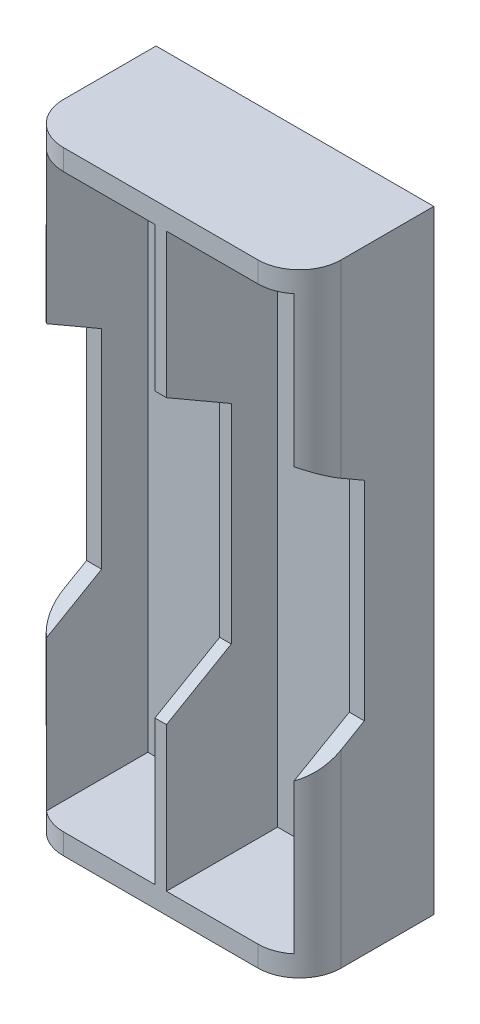
ISO-10303-21;
HEADER;
FILE_DESCRIPTION(('STEP AP214'),'2;1');
FILE_NAME('part.step','',(''),(''),'','','');
FILE_SCHEMA(('AUTOMOTIVE_DESIGN { 1 0 10303 214 1 1 1 1 }'));
ENDSEC;
DATA;
#1=APPLICATION_CONTEXT('core data for automotive mechanical design processes');
#2=APPLICATION_PROTOCOL_DEFINITION('international standard','automotive_design',2000,#1);
#3=PRODUCT_CONTEXT('',#1,'mechanical');
#4=PRODUCT('Part','Part','',(#3));
#5=PRODUCT_RELATED_PRODUCT_CATEGORY('part','',(#4));
#6=PRODUCT_DEFINITION_FORMATION('','',#4);
#7=PRODUCT_DEFINITION_CONTEXT('part definition',#1,'design');
#8=PRODUCT_DEFINITION('design','',#6,#7);
#9=PRODUCT_DEFINITION_SHAPE('','',#8);
#10=(LENGTH_UNIT() NAMED_UNIT(*) SI_UNIT(.MILLI.,.METRE.));
#11=(NAMED_UNIT(*) PLANE_ANGLE_UNIT() SI_UNIT($,.RADIAN.));
#12=(NAMED_UNIT(*) SI_UNIT($,.STERADIAN.) SOLID_ANGLE_UNIT());
#13=UNCERTAINTY_MEASURE_WITH_UNIT(LENGTH_MEASURE(1.E-05),#10,'distance_accuracy_value','');
#14=(GEOMETRIC_REPRESENTATION_CONTEXT(3) GLOBAL_UNCERTAINTY_ASSIGNED_CONTEXT((#13)) GLOBAL_UNIT_ASSIGNED_CONTEXT((#10,
#11,#12)) REPRESENTATION_CONTEXT('',''));
#15=CARTESIAN_POINT('',(0.,0.,0.));
#16=DIRECTION('',(0.,0.,1.));
#17=DIRECTION('',(1.,0.,0.));
#18=AXIS2_PLACEMENT_3D('',#15,#16,#17);
#19=CARTESIAN_POINT('',(8.4,52.3487910742456,8.));
#20=DIRECTION('',(0.,-1.,0.));
#21=DIRECTION('',(0.,0.,-1.));
#22=AXIS2_PLACEMENT_3D('',#19,#20,#21);
#23=CYLINDRICAL_SURFACE('',#22,3.6);
#24=CARTESIAN_POINT('',(8.4,-10.1547005383793,8.));
#25=DIRECTION('',(0.,-0.86602540378444,-0.499999999999998));
#26=DIRECTION('',(0.,-0.499999999999998,0.86602540378444));
#27=AXIS2_PLACEMENT_3D('',#24,#25,#26);
#28=ELLIPSE('',#27,4.1569219381653,3.6);
#29=CARTESIAN_POINT('',(10.7,-11.7536585324074,10.7694764848252));
#30=VERTEX_POINT('',#29);
#31=CARTESIAN_POINT('',(12.,-10.1547005383792,8.));
#32=VERTEX_POINT('',#31);
#33=EDGE_CURVE('E226',#30,#32,#28,.F.);
#34=ORIENTED_EDGE('',*,*,#33,.F.);
#35=DIRECTION('',(0.,-1.,0.));
#36=VECTOR('',#35,1.);
#37=CARTESIAN_POINT('',(10.7,52.3487910742456,10.7694764848252));
#38=LINE('',#37,#36);
#39=CARTESIAN_POINT('',(10.7,-24.7,10.7694764848252));
#40=VERTEX_POINT('',#39);
#41=EDGE_CURVE('E414',#40,#30,#38,.F.);
#42=ORIENTED_EDGE('',*,*,#41,.F.);
#43=CARTESIAN_POINT('',(8.4,-24.7,8.));
#44=DIRECTION('',(0.,-1.,0.));
#45=DIRECTION('',(0.,0.,-1.));
#46=AXIS2_PLACEMENT_3D('',#43,#44,#45);
#47=CIRCLE('',#46,3.6);
#48=CARTESIAN_POINT('',(8.4,-24.7,11.6));
#49=VERTEX_POINT('',#48);
#50=EDGE_CURVE('E355',#49,#40,#47,.F.);
#51=ORIENTED_EDGE('',*,*,#50,.F.);
#52=DIRECTION('',(0.,-1.,0.));
#53=VECTOR('',#52,1.);
#54=CARTESIAN_POINT('',(8.4,52.3487910742456,11.6));
#55=LINE('',#54,#53);
#56=CARTESIAN_POINT('',(8.4,-26.5,11.6));
#57=VERTEX_POINT('',#56);
#58=EDGE_CURVE('E375',#49,#57,#55,.T.);
#59=ORIENTED_EDGE('',*,*,#58,.T.);
#60=CARTESIAN_POINT('',(8.4,-26.5,8.));
#61=DIRECTION('',(0.,-1.,0.));
#62=DIRECTION('',(0.,0.,-1.));
#63=AXIS2_PLACEMENT_3D('',#60,#61,#62);
#64=CIRCLE('',#63,3.6);
#65=CARTESIAN_POINT('',(12.,-26.5,8.));
#66=VERTEX_POINT('',#65);
#67=EDGE_CURVE('E359',#66,#57,#64,.T.);
#68=ORIENTED_EDGE('',*,*,#67,.F.);
#69=DIRECTION('',(0.,-1.,0.));
#70=VECTOR('',#69,1.);
#71=CARTESIAN_POINT('',(12.,52.3487910742456,8.));
#72=LINE('',#71,#70);
#73=EDGE_CURVE('E377',#32,#66,#72,.T.);
#74=ORIENTED_EDGE('',*,*,#73,.F.);
#75=EDGE_LOOP('',(#34,#42,#51,#59,#68,#74));
#76=FACE_BOUND('',#75,.T.);
#77=ADVANCED_FACE('F35',(#76),#23,.T.);
#78=CARTESIAN_POINT('',(-8.4,52.3487910742456,8.));
#79=DIRECTION('',(0.,-1.,0.));
#80=DIRECTION('',(0.,0.,-1.));
#81=AXIS2_PLACEMENT_3D('',#78,#79,#80);
#82=CYLINDRICAL_SURFACE('',#81,3.6);
#83=CARTESIAN_POINT('',(-8.4,-10.1547005383793,8.));
#84=DIRECTION('',(0.,-0.86602540378444,-0.499999999999998));
#85=DIRECTION('',(0.,-0.499999999999998,0.86602540378444));
#86=AXIS2_PLACEMENT_3D('',#83,#84,#85);
#87=ELLIPSE('',#86,4.1569219381653,3.6);
#88=CARTESIAN_POINT('',(-12.,-10.1547005383792,8.));
#89=VERTEX_POINT('',#88);
#90=CARTESIAN_POINT('',(-10.7,-11.7536585324074,10.7694764848252));
#91=VERTEX_POINT('',#90);
#92=EDGE_CURVE('E286',#89,#91,#87,.F.);
#93=ORIENTED_EDGE('',*,*,#92,.F.);
#94=DIRECTION('',(0.,-1.,0.));
#95=VECTOR('',#94,1.);
#96=CARTESIAN_POINT('',(-12.,52.3487910742456,8.));
#97=LINE('',#96,#95);
#98=CARTESIAN_POINT('',(-12.,-26.5,8.));
#99=VERTEX_POINT('',#98);
#100=EDGE_CURVE('E381',#89,#99,#97,.T.);
#101=ORIENTED_EDGE('',*,*,#100,.T.);
#102=CARTESIAN_POINT('',(-8.4,-26.5,8.));
#103=DIRECTION('',(0.,-1.,0.));
#104=DIRECTION('',(0.,0.,1.));
#105=AXIS2_PLACEMENT_3D('',#102,#103,#104);
#106=CIRCLE('',#105,3.6);
#107=CARTESIAN_POINT('',(-8.4,-26.5,11.6));
#108=VERTEX_POINT('',#107);
#109=EDGE_CURVE('E372',#108,#99,#106,.T.);
#110=ORIENTED_EDGE('',*,*,#109,.F.);
#111=DIRECTION('',(0.,-1.,0.));
#112=VECTOR('',#111,1.);
#113=CARTESIAN_POINT('',(-8.4,52.3487910742456,11.6));
#114=LINE('',#113,#112);
#115=CARTESIAN_POINT('',(-8.4,-24.7,11.6));
#116=VERTEX_POINT('',#115);
#117=EDGE_CURVE('E385',#116,#108,#114,.T.);
#118=ORIENTED_EDGE('',*,*,#117,.F.);
#119=CARTESIAN_POINT('',(-8.4,-24.7,8.));
#120=DIRECTION('',(0.,-1.,0.));
#121=DIRECTION('',(1.,0.,0.));
#122=AXIS2_PLACEMENT_3D('',#119,#120,#121);
#123=CIRCLE('',#122,3.6);
#124=CARTESIAN_POINT('',(-10.7,-24.7,10.7694764848252));
#125=VERTEX_POINT('',#124);
#126=EDGE_CURVE('E323',#125,#116,#123,.F.);
#127=ORIENTED_EDGE('',*,*,#126,.F.);
#128=DIRECTION('',(0.,-1.,0.));
#129=VECTOR('',#128,1.);
#130=CARTESIAN_POINT('',(-10.7,52.3487910742456,10.7694764848252));
#131=LINE('',#130,#129);
#132=EDGE_CURVE('E419',#91,#125,#131,.T.);
#133=ORIENTED_EDGE('',*,*,#132,.F.);
#134=EDGE_LOOP('',(#93,#101,#110,#118,#127,#133));
#135=FACE_BOUND('',#134,.T.);
#136=ADVANCED_FACE('F461',(#135),#82,.T.);
#137=CARTESIAN_POINT('',(-8.4,52.3487910742456,11.6));
#138=DIRECTION('',(0.,0.,1.));
#139=DIRECTION('',(1.,0.,0.));
#140=AXIS2_PLACEMENT_3D('',#137,#138,#139);
#141=PLANE('',#140);
#142=DIRECTION('',(1.,0.,0.));
#143=VECTOR('',#142,1.);
#144=CARTESIAN_POINT('',(-8.4,-12.2331615074619,11.6));
#145=LINE('',#144,#143);
#146=CARTESIAN_POINT('',(-0.499999999999997,-12.2331615074619,11.6));
#147=VERTEX_POINT('',#146);
#148=CARTESIAN_POINT('',(0.500000000000004,-12.2331615074619,11.6));
#149=VERTEX_POINT('',#148);
#150=EDGE_CURVE('E278',#147,#149,#145,.T.);
#151=ORIENTED_EDGE('',*,*,#150,.F.);
#152=DIRECTION('',(0.,1.,0.));
#153=VECTOR('',#152,1.);
#154=CARTESIAN_POINT('',(-0.499999999999997,24.7,11.6));
#155=LINE('',#154,#153);
#156=CARTESIAN_POINT('',(-0.499999999999997,-24.7,11.6));
#157=VERTEX_POINT('',#156);
#158=EDGE_CURVE('E292',#157,#147,#155,.T.);
#159=ORIENTED_EDGE('',*,*,#158,.F.);
#160=DIRECTION('',(1.,0.,0.));
#161=VECTOR('',#160,1.);
#162=CARTESIAN_POINT('',(-8.40000000000003,-24.7,11.6));
#163=LINE('',#162,#161);
#164=EDGE_CURVE('E417',#116,#157,#163,.T.);
#165=ORIENTED_EDGE('',*,*,#164,.F.);
#166=ORIENTED_EDGE('',*,*,#117,.T.);
#167=DIRECTION('',(-1.,0.,0.));
#168=VECTOR('',#167,1.);
#169=CARTESIAN_POINT('',(-8.4,-26.5,11.6));
#170=LINE('',#169,#168);
#171=EDGE_CURVE('E369',#57,#108,#170,.T.);
#172=ORIENTED_EDGE('',*,*,#171,.F.);
#173=ORIENTED_EDGE('',*,*,#58,.F.);
#174=DIRECTION('',(1.,0.,0.));
#175=VECTOR('',#174,1.);
#176=CARTESIAN_POINT('',(0.500000000000003,-24.7,11.6));
#177=LINE('',#176,#175);
#178=CARTESIAN_POINT('',(0.500000000000002,-24.7,11.6));
#179=VERTEX_POINT('',#178);
#180=EDGE_CURVE('E326',#179,#49,#177,.T.);
#181=ORIENTED_EDGE('',*,*,#180,.F.);
#182=DIRECTION('',(0.,-1.,0.));
#183=VECTOR('',#182,1.);
#184=CARTESIAN_POINT('',(0.500000000000003,24.7,11.6));
#185=LINE('',#184,#183);
#186=EDGE_CURVE('E325',#149,#179,#185,.T.);
#187=ORIENTED_EDGE('',*,*,#186,.F.);
#188=EDGE_LOOP('',(#151,#159,#165,#166,#172,#173,#181,#187));
#189=FACE_BOUND('',#188,.T.);
#190=ADVANCED_FACE('F469',(#189),#141,.T.);
#191=CARTESIAN_POINT('',(12.,-26.5,2.));
#192=DIRECTION('',(-1.,0.,0.));
#193=DIRECTION('',(0.,0.,1.));
#194=AXIS2_PLACEMENT_3D('',#191,#192,#193);
#195=PLANE('',#194);
#196=DIRECTION('',(0.,1.,0.));
#197=VECTOR('',#196,1.);
#198=CARTESIAN_POINT('',(12.,9.,6.));
#199=LINE('',#198,#197);
#200=CARTESIAN_POINT('',(12.,-9.,6.));
#201=VERTEX_POINT('',#200);
#202=CARTESIAN_POINT('',(12.,9.,6.));
#203=VERTEX_POINT('',#202);
#204=EDGE_CURVE('E230',#201,#203,#199,.T.);
#205=ORIENTED_EDGE('',*,*,#204,.F.);
#206=DIRECTION('',(0.,0.499999999999998,-0.86602540378444));
#207=VECTOR('',#206,1.);
#208=CARTESIAN_POINT('',(12.,-15.11991285341,16.6));
#209=LINE('',#208,#207);
#210=EDGE_CURVE('E220',#32,#201,#209,.T.);
#211=ORIENTED_EDGE('',*,*,#210,.F.);
#212=ORIENTED_EDGE('',*,*,#73,.T.);
#213=DIRECTION('',(0.,0.,-1.));
#214=VECTOR('',#213,1.);
#215=CARTESIAN_POINT('',(12.,-26.5,2.));
#216=LINE('',#215,#214);
#217=CARTESIAN_POINT('',(12.,-26.5,0.));
#218=VERTEX_POINT('',#217);
#219=EDGE_CURVE('E399',#66,#218,#216,.T.);
#220=ORIENTED_EDGE('',*,*,#219,.T.);
#221=DIRECTION('',(0.,1.,0.));
#222=VECTOR('',#221,1.);
#223=CARTESIAN_POINT('',(12.,-26.5,0.));
#224=LINE('',#223,#222);
#225=CARTESIAN_POINT('',(12.,26.5,0.));
#226=VERTEX_POINT('',#225);
#227=EDGE_CURVE('E390',#218,#226,#224,.T.);
#228=ORIENTED_EDGE('',*,*,#227,.T.);
#229=DIRECTION('',(0.,0.,-1.));
#230=VECTOR('',#229,1.);
#231=CARTESIAN_POINT('',(12.,26.5,2.));
#232=LINE('',#231,#230);
#233=CARTESIAN_POINT('',(12.,26.5,8.));
#234=VERTEX_POINT('',#233);
#235=EDGE_CURVE('E408',#234,#226,#232,.T.);
#236=ORIENTED_EDGE('',*,*,#235,.F.);
#237=CARTESIAN_POINT('',(12.,10.1547005383792,8.));
#238=VERTEX_POINT('',#237);
#239=EDGE_CURVE('E363',#234,#238,#72,.T.);
#240=ORIENTED_EDGE('',*,*,#239,.T.);
#241=DIRECTION('',(0.,0.499999999999998,0.86602540378444));
#242=VECTOR('',#241,1.);
#243=CARTESIAN_POINT('',(12.,15.11991285341,16.6));
#244=LINE('',#243,#242);
#245=EDGE_CURVE('E240',#203,#238,#244,.T.);
#246=ORIENTED_EDGE('',*,*,#245,.F.);
#247=EDGE_LOOP('',(#205,#211,#212,#220,#228,#236,#240,#246));
#248=FACE_BOUND('',#247,.T.);
#249=ADVANCED_FACE('F37',(#248),#195,.F.);
#250=CARTESIAN_POINT('',(-12.,26.5,2.));
#251=DIRECTION('',(0.,-1.,0.));
#252=DIRECTION('',(0.,0.,-1.));
#253=AXIS2_PLACEMENT_3D('',#250,#251,#252);
#254=PLANE('',#253);
#255=DIRECTION('',(-1.,0.,0.));
#256=VECTOR('',#255,1.);
#257=CARTESIAN_POINT('',(-12.,26.5,0.));
#258=LINE('',#257,#256);
#259=CARTESIAN_POINT('',(-12.,26.5,0.));
#260=VERTEX_POINT('',#259);
#261=EDGE_CURVE('E393',#226,#260,#258,.T.);
#262=ORIENTED_EDGE('',*,*,#261,.T.);
#263=DIRECTION('',(0.,0.,-1.));
#264=VECTOR('',#263,1.);
#265=CARTESIAN_POINT('',(-12.,26.5,2.));
#266=LINE('',#265,#264);
#267=CARTESIAN_POINT('',(-12.,26.5,8.));
#268=VERTEX_POINT('',#267);
#269=EDGE_CURVE('E405',#268,#260,#266,.T.);
#270=ORIENTED_EDGE('',*,*,#269,.F.);
#271=CARTESIAN_POINT('',(-8.4,26.5,8.));
#272=DIRECTION('',(0.,-1.,0.));
#273=DIRECTION('',(0.,0.,-1.));
#274=AXIS2_PLACEMENT_3D('',#271,#272,#273);
#275=CIRCLE('',#274,3.6);
#276=CARTESIAN_POINT('',(-8.4,26.5,11.6));
#277=VERTEX_POINT('',#276);
#278=EDGE_CURVE('E360',#268,#277,#275,.F.);
#279=ORIENTED_EDGE('',*,*,#278,.T.);
#280=DIRECTION('',(1.,0.,0.));
#281=VECTOR('',#280,1.);
#282=CARTESIAN_POINT('',(-8.4,26.5,11.6));
#283=LINE('',#282,#281);
#284=CARTESIAN_POINT('',(8.4,26.5,11.6));
#285=VERTEX_POINT('',#284);
#286=EDGE_CURVE('E366',#277,#285,#283,.T.);
#287=ORIENTED_EDGE('',*,*,#286,.T.);
#288=CARTESIAN_POINT('',(8.4,26.5,8.));
#289=DIRECTION('',(0.,-1.,0.));
#290=DIRECTION('',(0.,0.,-1.));
#291=AXIS2_PLACEMENT_3D('',#288,#289,#290);
#292=CIRCLE('',#291,3.6);
#293=EDGE_CURVE('E362',#285,#234,#292,.F.);
#294=ORIENTED_EDGE('',*,*,#293,.T.);
#295=ORIENTED_EDGE('',*,*,#235,.T.);
#296=EDGE_LOOP('',(#262,#270,#279,#287,#294,#295));
#297=FACE_BOUND('',#296,.T.);
#298=ADVANCED_FACE('F503',(#297),#254,.F.);
#299=CARTESIAN_POINT('',(-12.,-26.5,2.));
#300=DIRECTION('',(1.,0.,0.));
#301=DIRECTION('',(0.,0.,-1.));
#302=AXIS2_PLACEMENT_3D('',#299,#300,#301);
#303=PLANE('',#302);
#304=ORIENTED_EDGE('',*,*,#100,.F.);
#305=DIRECTION('',(0.,0.499999999999998,-0.86602540378444));
#306=VECTOR('',#305,1.);
#307=CARTESIAN_POINT('',(-12.,-15.11991285341,16.6));
#308=LINE('',#307,#306);
#309=CARTESIAN_POINT('',(-12.,-9.,6.));
#310=VERTEX_POINT('',#309);
#311=EDGE_CURVE('E242',#89,#310,#308,.T.);
#312=ORIENTED_EDGE('',*,*,#311,.T.);
#313=DIRECTION('',(0.,1.,0.));
#314=VECTOR('',#313,1.);
#315=CARTESIAN_POINT('',(-12.,9.,6.));
#316=LINE('',#315,#314);
#317=CARTESIAN_POINT('',(-12.,9.,6.));
#318=VERTEX_POINT('',#317);
#319=EDGE_CURVE('E247',#310,#318,#316,.T.);
#320=ORIENTED_EDGE('',*,*,#319,.T.);
#321=DIRECTION('',(0.,0.499999999999998,0.86602540378444));
#322=VECTOR('',#321,1.);
#323=CARTESIAN_POINT('',(-12.,15.11991285341,16.6));
#324=LINE('',#323,#322);
#325=CARTESIAN_POINT('',(-12.,10.1547005383792,8.));
#326=VERTEX_POINT('',#325);
#327=EDGE_CURVE('E237',#318,#326,#324,.T.);
#328=ORIENTED_EDGE('',*,*,#327,.T.);
#329=EDGE_CURVE('E378',#268,#326,#97,.T.);
#330=ORIENTED_EDGE('',*,*,#329,.F.);
#331=ORIENTED_EDGE('',*,*,#269,.T.);
#332=DIRECTION('',(0.,-1.,0.));
#333=VECTOR('',#332,1.);
#334=CARTESIAN_POINT('',(-12.,-26.5,0.));
#335=LINE('',#334,#333);
#336=CARTESIAN_POINT('',(-12.,-26.5,0.));
#337=VERTEX_POINT('',#336);
#338=EDGE_CURVE('E395',#260,#337,#335,.T.);
#339=ORIENTED_EDGE('',*,*,#338,.T.);
#340=DIRECTION('',(0.,0.,-1.));
#341=VECTOR('',#340,1.);
#342=CARTESIAN_POINT('',(-12.,-26.5,2.));
#343=LINE('',#342,#341);
#344=EDGE_CURVE('E402',#99,#337,#343,.T.);
#345=ORIENTED_EDGE('',*,*,#344,.F.);
#346=EDGE_LOOP('',(#304,#312,#320,#328,#330,#331,#339,#345));
#347=FACE_BOUND('',#346,.T.);
#348=ADVANCED_FACE('F522',(#347),#303,.F.);
#349=CARTESIAN_POINT('',(-12.,-26.5,2.));
#350=DIRECTION('',(0.,1.,0.));
#351=DIRECTION('',(0.,0.,1.));
#352=AXIS2_PLACEMENT_3D('',#349,#350,#351);
#353=PLANE('',#352);
#354=DIRECTION('',(1.,0.,0.));
#355=VECTOR('',#354,1.);
#356=CARTESIAN_POINT('',(-12.,-26.5,0.));
#357=LINE('',#356,#355);
#358=EDGE_CURVE('E397',#337,#218,#357,.T.);
#359=ORIENTED_EDGE('',*,*,#358,.T.);
#360=ORIENTED_EDGE('',*,*,#219,.F.);
#361=ORIENTED_EDGE('',*,*,#67,.T.);
#362=ORIENTED_EDGE('',*,*,#171,.T.);
#363=ORIENTED_EDGE('',*,*,#109,.T.);
#364=ORIENTED_EDGE('',*,*,#344,.T.);
#365=EDGE_LOOP('',(#359,#360,#361,#362,#363,#364));
#366=FACE_BOUND('',#365,.T.);
#367=ADVANCED_FACE('F494',(#366),#353,.F.);
#368=CARTESIAN_POINT('',(0.,0.,0.));
#369=DIRECTION('',(0.,0.,-1.));
#370=DIRECTION('',(-1.,0.,0.));
#371=AXIS2_PLACEMENT_3D('',#368,#369,#370);
#372=PLANE('',#371);
#373=ORIENTED_EDGE('',*,*,#227,.F.);
#374=ORIENTED_EDGE('',*,*,#358,.F.);
#375=ORIENTED_EDGE('',*,*,#338,.F.);
#376=ORIENTED_EDGE('',*,*,#261,.F.);
#377=EDGE_LOOP('',(#373,#374,#375,#376));
#378=FACE_BOUND('',#377,.T.);
#379=ADVANCED_FACE('F499',(#378),#372,.T.);
#380=CARTESIAN_POINT('',(8.4,10.1547005383792,8.));
#381=DIRECTION('',(0.,0.86602540378444,-0.499999999999998));
#382=DIRECTION('',(0.,-0.499999999999998,-0.86602540378444));
#383=AXIS2_PLACEMENT_3D('',#380,#381,#382);
#384=ELLIPSE('',#383,4.1569219381653,3.6);
#385=CARTESIAN_POINT('',(10.7,11.7536585324074,10.7694764848252));
#386=VERTEX_POINT('',#385);
#387=EDGE_CURVE('E276',#238,#386,#384,.F.);
#388=ORIENTED_EDGE('',*,*,#387,.F.);
#389=ORIENTED_EDGE('',*,*,#239,.F.);
#390=ORIENTED_EDGE('',*,*,#293,.F.);
#391=CARTESIAN_POINT('',(8.4,24.7,11.6));
#392=VERTEX_POINT('',#391);
#393=EDGE_CURVE('E386',#285,#392,#55,.T.);
#394=ORIENTED_EDGE('',*,*,#393,.T.);
#395=CARTESIAN_POINT('',(8.4,24.7,8.));
#396=DIRECTION('',(0.,1.,0.));
#397=DIRECTION('',(0.,0.,1.));
#398=AXIS2_PLACEMENT_3D('',#395,#396,#397);
#399=CIRCLE('',#398,3.6);
#400=CARTESIAN_POINT('',(10.7,24.7,10.7694764848252));
#401=VERTEX_POINT('',#400);
#402=EDGE_CURVE('E357',#401,#392,#399,.F.);
#403=ORIENTED_EDGE('',*,*,#402,.F.);
#404=EDGE_CURVE('E413',#386,#401,#38,.F.);
#405=ORIENTED_EDGE('',*,*,#404,.F.);
#406=EDGE_LOOP('',(#388,#389,#390,#394,#403,#405));
#407=FACE_BOUND('',#406,.T.);
#408=ADVANCED_FACE('F506',(#407),#23,.T.);
#409=CARTESIAN_POINT('',(-8.4,10.1547005383792,8.));
#410=DIRECTION('',(0.,0.86602540378444,-0.499999999999998));
#411=DIRECTION('',(0.,-0.499999999999998,-0.86602540378444));
#412=AXIS2_PLACEMENT_3D('',#409,#410,#411);
#413=ELLIPSE('',#412,4.1569219381653,3.6);
#414=CARTESIAN_POINT('',(-10.7,11.7536585324074,10.7694764848252));
#415=VERTEX_POINT('',#414);
#416=EDGE_CURVE('E271',#415,#326,#413,.F.);
#417=ORIENTED_EDGE('',*,*,#416,.F.);
#418=CARTESIAN_POINT('',(-10.7,24.7,10.7694764848252));
#419=VERTEX_POINT('',#418);
#420=EDGE_CURVE('E420',#419,#415,#131,.T.);
#421=ORIENTED_EDGE('',*,*,#420,.F.);
#422=CARTESIAN_POINT('',(-8.4,24.7,8.));
#423=DIRECTION('',(0.,1.,0.));
#424=DIRECTION('',(-1.,0.,0.));
#425=AXIS2_PLACEMENT_3D('',#422,#423,#424);
#426=CIRCLE('',#425,3.6);
#427=CARTESIAN_POINT('',(-8.4,24.7,11.6));
#428=VERTEX_POINT('',#427);
#429=EDGE_CURVE('E321',#428,#419,#426,.F.);
#430=ORIENTED_EDGE('',*,*,#429,.F.);
#431=EDGE_CURVE('E382',#277,#428,#114,.T.);
#432=ORIENTED_EDGE('',*,*,#431,.F.);
#433=ORIENTED_EDGE('',*,*,#278,.F.);
#434=ORIENTED_EDGE('',*,*,#329,.T.);
#435=EDGE_LOOP('',(#417,#421,#430,#432,#433,#434));
#436=FACE_BOUND('',#435,.T.);
#437=ADVANCED_FACE('F447',(#436),#82,.T.);
#438=DIRECTION('',(-1.,0.,0.));
#439=VECTOR('',#438,1.);
#440=CARTESIAN_POINT('',(-8.4,12.2331615074619,11.6));
#441=LINE('',#440,#439);
#442=CARTESIAN_POINT('',(0.500000000000004,12.2331615074619,11.6));
#443=VERTEX_POINT('',#442);
#444=CARTESIAN_POINT('',(-0.499999999999997,12.2331615074619,11.6));
#445=VERTEX_POINT('',#444);
#446=EDGE_CURVE('E263',#443,#445,#441,.T.);
#447=ORIENTED_EDGE('',*,*,#446,.F.);
#448=CARTESIAN_POINT('',(0.500000000000003,24.7,11.6));
#449=VERTEX_POINT('',#448);
#450=EDGE_CURVE('E329',#449,#443,#185,.T.);
#451=ORIENTED_EDGE('',*,*,#450,.F.);
#452=DIRECTION('',(-1.,0.,0.));
#453=VECTOR('',#452,1.);
#454=CARTESIAN_POINT('',(-8.4,24.7,11.6));
#455=LINE('',#454,#453);
#456=EDGE_CURVE('E411',#392,#449,#455,.T.);
#457=ORIENTED_EDGE('',*,*,#456,.F.);
#458=ORIENTED_EDGE('',*,*,#393,.F.);
#459=ORIENTED_EDGE('',*,*,#286,.F.);
#460=ORIENTED_EDGE('',*,*,#431,.T.);
#461=DIRECTION('',(-1.,0.,0.));
#462=VECTOR('',#461,1.);
#463=CARTESIAN_POINT('',(-0.499999999999997,24.7,11.6));
#464=LINE('',#463,#462);
#465=CARTESIAN_POINT('',(-0.499999999999997,24.7,11.6));
#466=VERTEX_POINT('',#465);
#467=EDGE_CURVE('E291',#466,#428,#464,.T.);
#468=ORIENTED_EDGE('',*,*,#467,.F.);
#469=EDGE_CURVE('E296',#445,#466,#155,.T.);
#470=ORIENTED_EDGE('',*,*,#469,.F.);
#471=EDGE_LOOP('',(#447,#451,#457,#458,#459,#460,#468,#470));
#472=FACE_BOUND('',#471,.T.);
#473=ADVANCED_FACE('F436',(#472),#141,.T.);
#474=CARTESIAN_POINT('',(0.,0.,2.));
#475=DIRECTION('',(0.,0.,-1.));
#476=DIRECTION('',(-1.,0.,0.));
#477=AXIS2_PLACEMENT_3D('',#474,#475,#476);
#478=PLANE('',#477);
#479=DIRECTION('',(0.,1.,0.));
#480=VECTOR('',#479,1.);
#481=CARTESIAN_POINT('',(10.7,24.7,2.));
#482=LINE('',#481,#480);
#483=CARTESIAN_POINT('',(10.7,-24.7,2.));
#484=VERTEX_POINT('',#483);
#485=CARTESIAN_POINT('',(10.7,24.7,2.));
#486=VERTEX_POINT('',#485);
#487=EDGE_CURVE('E335',#484,#486,#482,.T.);
#488=ORIENTED_EDGE('',*,*,#487,.T.);
#489=DIRECTION('',(-1.,0.,0.));
#490=VECTOR('',#489,1.);
#491=CARTESIAN_POINT('',(0.500000000000003,24.7,2.));
#492=LINE('',#491,#490);
#493=CARTESIAN_POINT('',(0.500000000000003,24.7,1.99999999999999));
#494=VERTEX_POINT('',#493);
#495=EDGE_CURVE('E328',#486,#494,#492,.T.);
#496=ORIENTED_EDGE('',*,*,#495,.T.);
#497=DIRECTION('',(0.,-1.,0.));
#498=VECTOR('',#497,1.);
#499=CARTESIAN_POINT('',(0.500000000000003,24.7,2.));
#500=LINE('',#499,#498);
#501=CARTESIAN_POINT('',(0.500000000000003,-24.7,2.));
#502=VERTEX_POINT('',#501);
#503=EDGE_CURVE('E344',#494,#502,#500,.T.);
#504=ORIENTED_EDGE('',*,*,#503,.T.);
#505=DIRECTION('',(1.,0.,0.));
#506=VECTOR('',#505,1.);
#507=CARTESIAN_POINT('',(0.500000000000003,-24.7,2.));
#508=LINE('',#507,#506);
#509=EDGE_CURVE('E340',#502,#484,#508,.T.);
#510=ORIENTED_EDGE('',*,*,#509,.T.);
#511=EDGE_LOOP('',(#488,#496,#504,#510));
#512=FACE_BOUND('',#511,.T.);
#513=ADVANCED_FACE('F514',(#512),#478,.F.);
#514=CARTESIAN_POINT('',(0.500000000000003,24.7,-50.4420459537478));
#515=DIRECTION('',(0.,1.,0.));
#516=DIRECTION('',(0.,0.,1.));
#517=AXIS2_PLACEMENT_3D('',#514,#515,#516);
#518=PLANE('',#517);
#519=ORIENTED_EDGE('',*,*,#402,.T.);
#520=ORIENTED_EDGE('',*,*,#456,.T.);
#521=DIRECTION('',(0.,0.,1.));
#522=VECTOR('',#521,1.);
#523=CARTESIAN_POINT('',(0.500000000000003,24.7,-50.4420459537478));
#524=LINE('',#523,#522);
#525=EDGE_CURVE('E334',#494,#449,#524,.T.);
#526=ORIENTED_EDGE('',*,*,#525,.F.);
#527=ORIENTED_EDGE('',*,*,#495,.F.);
#528=DIRECTION('',(0.,0.,1.));
#529=VECTOR('',#528,1.);
#530=CARTESIAN_POINT('',(10.7,24.7,-50.4420459537478));
#531=LINE('',#530,#529);
#532=EDGE_CURVE('E338',#486,#401,#531,.T.);
#533=ORIENTED_EDGE('',*,*,#532,.T.);
#534=EDGE_LOOP('',(#519,#520,#526,#527,#533));
#535=FACE_BOUND('',#534,.T.);
#536=ADVANCED_FACE('F510',(#535),#518,.F.);
#537=CARTESIAN_POINT('',(0.500000000000003,24.7,-50.4420459537478));
#538=DIRECTION('',(-1.,0.,0.));
#539=DIRECTION('',(0.,0.,1.));
#540=AXIS2_PLACEMENT_3D('',#537,#538,#539);
#541=PLANE('',#540);
#542=DIRECTION('',(0.,-1.,0.));
#543=VECTOR('',#542,1.);
#544=CARTESIAN_POINT('',(0.500000000000003,24.7,6.));
#545=LINE('',#544,#543);
#546=CARTESIAN_POINT('',(0.500000000000004,9.,6.));
#547=VERTEX_POINT('',#546);
#548=CARTESIAN_POINT('',(0.500000000000004,-9.,6.));
#549=VERTEX_POINT('',#548);
#550=EDGE_CURVE('E260',#547,#549,#545,.T.);
#551=ORIENTED_EDGE('',*,*,#550,.T.);
#552=DIRECTION('',(0.,-0.499999999999998,0.86602540378444));
#553=VECTOR('',#552,1.);
#554=CARTESIAN_POINT('',(0.500000000000003,23.865122818757,-50.9240625190787));
#555=LINE('',#554,#553);
#556=EDGE_CURVE('E280',#549,#149,#555,.T.);
#557=ORIENTED_EDGE('',*,*,#556,.T.);
#558=ORIENTED_EDGE('',*,*,#186,.T.);
#559=DIRECTION('',(0.,0.,1.));
#560=VECTOR('',#559,1.);
#561=CARTESIAN_POINT('',(0.500000000000003,-24.7,-50.4420459537478));
#562=LINE('',#561,#560);
#563=EDGE_CURVE('E343',#502,#179,#562,.T.);
#564=ORIENTED_EDGE('',*,*,#563,.F.);
#565=ORIENTED_EDGE('',*,*,#503,.F.);
#566=ORIENTED_EDGE('',*,*,#525,.T.);
#567=ORIENTED_EDGE('',*,*,#450,.T.);
#568=DIRECTION('',(0.,-0.499999999999998,-0.86602540378444));
#569=VECTOR('',#568,1.);
#570=CARTESIAN_POINT('',(0.500000000000003,-11.5151228187571,-29.5332350456031));
#571=LINE('',#570,#569);
#572=EDGE_CURVE('E265',#443,#547,#571,.T.);
#573=ORIENTED_EDGE('',*,*,#572,.T.);
#574=EDGE_LOOP('',(#551,#557,#558,#564,#565,#566,#567,#573));
#575=FACE_BOUND('',#574,.T.);
#576=ADVANCED_FACE('F479',(#575),#541,.F.);
#577=CARTESIAN_POINT('',(0.500000000000003,-24.7,-50.4420459537478));
#578=DIRECTION('',(0.,-1.,0.));
#579=DIRECTION('',(0.,0.,-1.));
#580=AXIS2_PLACEMENT_3D('',#577,#578,#579);
#581=PLANE('',#580);
#582=ORIENTED_EDGE('',*,*,#50,.T.);
#583=DIRECTION('',(0.,0.,1.));
#584=VECTOR('',#583,1.);
#585=CARTESIAN_POINT('',(10.7,-24.7,-50.4420459537478));
#586=LINE('',#585,#584);
#587=EDGE_CURVE('E339',#484,#40,#586,.T.);
#588=ORIENTED_EDGE('',*,*,#587,.F.);
#589=ORIENTED_EDGE('',*,*,#509,.F.);
#590=ORIENTED_EDGE('',*,*,#563,.T.);
#591=ORIENTED_EDGE('',*,*,#180,.T.);
#592=EDGE_LOOP('',(#582,#588,#589,#590,#591));
#593=FACE_BOUND('',#592,.T.);
#594=ADVANCED_FACE('F517',(#593),#581,.F.);
#595=CARTESIAN_POINT('',(10.7,24.7,-50.4420459537478));
#596=DIRECTION('',(1.,0.,0.));
#597=DIRECTION('',(0.,0.,-1.));
#598=AXIS2_PLACEMENT_3D('',#595,#596,#597);
#599=PLANE('',#598);
#600=ORIENTED_EDGE('',*,*,#41,.T.);
#601=DIRECTION('',(0.,0.499999999999998,-0.86602540378444));
#602=VECTOR('',#601,1.);
#603=CARTESIAN_POINT('',(10.7,23.865122818757,-50.9240625190787));
#604=LINE('',#603,#602);
#605=CARTESIAN_POINT('',(10.7,-9.,6.));
#606=VERTEX_POINT('',#605);
#607=EDGE_CURVE('E288',#30,#606,#604,.T.);
#608=ORIENTED_EDGE('',*,*,#607,.T.);
#609=DIRECTION('',(0.,1.,0.));
#610=VECTOR('',#609,1.);
#611=CARTESIAN_POINT('',(10.7,24.7,6.));
#612=LINE('',#611,#610);
#613=CARTESIAN_POINT('',(10.7,9.,6.));
#614=VERTEX_POINT('',#613);
#615=EDGE_CURVE('E235',#606,#614,#612,.T.);
#616=ORIENTED_EDGE('',*,*,#615,.T.);
#617=DIRECTION('',(0.,0.499999999999998,0.86602540378444));
#618=VECTOR('',#617,1.);
#619=CARTESIAN_POINT('',(10.7,-11.5151228187571,-29.5332350456031));
#620=LINE('',#619,#618);
#621=EDGE_CURVE('E273',#614,#386,#620,.T.);
#622=ORIENTED_EDGE('',*,*,#621,.T.);
#623=ORIENTED_EDGE('',*,*,#404,.T.);
#624=ORIENTED_EDGE('',*,*,#532,.F.);
#625=ORIENTED_EDGE('',*,*,#487,.F.);
#626=ORIENTED_EDGE('',*,*,#587,.T.);
#627=EDGE_LOOP('',(#600,#608,#616,#622,#623,#624,#625,#626));
#628=FACE_BOUND('',#627,.T.);
#629=ADVANCED_FACE('F486',(#628),#599,.F.);
#630=CARTESIAN_POINT('',(0.,0.,2.));
#631=DIRECTION('',(0.,0.,-1.));
#632=DIRECTION('',(-1.,0.,0.));
#633=AXIS2_PLACEMENT_3D('',#630,#631,#632);
#634=PLANE('',#633);
#635=DIRECTION('',(-1.,0.,0.));
#636=VECTOR('',#635,1.);
#637=CARTESIAN_POINT('',(-0.499999999999997,24.7,2.));
#638=LINE('',#637,#636);
#639=CARTESIAN_POINT('',(-0.499999999999997,24.7,2.));
#640=VERTEX_POINT('',#639);
#641=CARTESIAN_POINT('',(-10.7,24.7,2.));
#642=VERTEX_POINT('',#641);
#643=EDGE_CURVE('E301',#640,#642,#638,.T.);
#644=ORIENTED_EDGE('',*,*,#643,.T.);
#645=DIRECTION('',(0.,-1.,0.));
#646=VECTOR('',#645,1.);
#647=CARTESIAN_POINT('',(-10.7,24.7,2.));
#648=LINE('',#647,#646);
#649=CARTESIAN_POINT('',(-10.7,-24.7,1.99999999999999));
#650=VERTEX_POINT('',#649);
#651=EDGE_CURVE('E295',#642,#650,#648,.T.);
#652=ORIENTED_EDGE('',*,*,#651,.T.);
#653=DIRECTION('',(1.,0.,0.));
#654=VECTOR('',#653,1.);
#655=CARTESIAN_POINT('',(-0.499999999999997,-24.7,2.));
#656=LINE('',#655,#654);
#657=CARTESIAN_POINT('',(-0.499999999999997,-24.7,2.));
#658=VERTEX_POINT('',#657);
#659=EDGE_CURVE('E310',#650,#658,#656,.T.);
#660=ORIENTED_EDGE('',*,*,#659,.T.);
#661=DIRECTION('',(0.,1.,0.));
#662=VECTOR('',#661,1.);
#663=CARTESIAN_POINT('',(-0.499999999999997,24.7,2.));
#664=LINE('',#663,#662);
#665=EDGE_CURVE('E306',#658,#640,#664,.T.);
#666=ORIENTED_EDGE('',*,*,#665,.T.);
#667=EDGE_LOOP('',(#644,#652,#660,#666));
#668=FACE_BOUND('',#667,.T.);
#669=ADVANCED_FACE('F454',(#668),#634,.F.);
#670=CARTESIAN_POINT('',(-10.7,24.7,-50.4420459537478));
#671=DIRECTION('',(-1.,0.,0.));
#672=DIRECTION('',(0.,0.,1.));
#673=AXIS2_PLACEMENT_3D('',#670,#671,#672);
#674=PLANE('',#673);
#675=DIRECTION('',(0.,-1.,0.));
#676=VECTOR('',#675,1.);
#677=CARTESIAN_POINT('',(-10.7,24.7,6.));
#678=LINE('',#677,#676);
#679=CARTESIAN_POINT('',(-10.7,9.,6.));
#680=VERTEX_POINT('',#679);
#681=CARTESIAN_POINT('',(-10.7,-9.,5.99999999999999));
#682=VERTEX_POINT('',#681);
#683=EDGE_CURVE('E254',#680,#682,#678,.T.);
#684=ORIENTED_EDGE('',*,*,#683,.T.);
#685=DIRECTION('',(0.,-0.499999999999998,0.86602540378444));
#686=VECTOR('',#685,1.);
#687=CARTESIAN_POINT('',(-10.7,23.865122818757,-50.9240625190787));
#688=LINE('',#687,#686);
#689=EDGE_CURVE('E283',#682,#91,#688,.T.);
#690=ORIENTED_EDGE('',*,*,#689,.T.);
#691=ORIENTED_EDGE('',*,*,#132,.T.);
#692=DIRECTION('',(0.,0.,1.));
#693=VECTOR('',#692,1.);
#694=CARTESIAN_POINT('',(-10.7,-24.7,-50.4420459537478));
#695=LINE('',#694,#693);
#696=EDGE_CURVE('E300',#650,#125,#695,.T.);
#697=ORIENTED_EDGE('',*,*,#696,.F.);
#698=ORIENTED_EDGE('',*,*,#651,.F.);
#699=DIRECTION('',(0.,0.,1.));
#700=VECTOR('',#699,1.);
#701=CARTESIAN_POINT('',(-10.7,24.7,-50.4420459537478));
#702=LINE('',#701,#700);
#703=EDGE_CURVE('E304',#642,#419,#702,.T.);
#704=ORIENTED_EDGE('',*,*,#703,.T.);
#705=ORIENTED_EDGE('',*,*,#420,.T.);
#706=DIRECTION('',(0.,-0.499999999999998,-0.86602540378444));
#707=VECTOR('',#706,1.);
#708=CARTESIAN_POINT('',(-10.7,-11.5151228187571,-29.5332350456031));
#709=LINE('',#708,#707);
#710=EDGE_CURVE('E268',#415,#680,#709,.T.);
#711=ORIENTED_EDGE('',*,*,#710,.T.);
#712=EDGE_LOOP('',(#684,#690,#691,#697,#698,#704,#705,#711));
#713=FACE_BOUND('',#712,.T.);
#714=ADVANCED_FACE('F450',(#713),#674,.F.);
#715=CARTESIAN_POINT('',(-0.499999999999997,-24.7,-50.4420459537478));
#716=DIRECTION('',(0.,-1.,0.));
#717=DIRECTION('',(1.,0.,0.));
#718=AXIS2_PLACEMENT_3D('',#715,#716,#717);
#719=PLANE('',#718);
#720=ORIENTED_EDGE('',*,*,#126,.T.);
#721=ORIENTED_EDGE('',*,*,#164,.T.);
#722=DIRECTION('',(0.,0.,1.));
#723=VECTOR('',#722,1.);
#724=CARTESIAN_POINT('',(-0.499999999999997,-24.7,-50.4420459537478));
#725=LINE('',#724,#723);
#726=EDGE_CURVE('E309',#658,#157,#725,.T.);
#727=ORIENTED_EDGE('',*,*,#726,.F.);
#728=ORIENTED_EDGE('',*,*,#659,.F.);
#729=ORIENTED_EDGE('',*,*,#696,.T.);
#730=EDGE_LOOP('',(#720,#721,#727,#728,#729));
#731=FACE_BOUND('',#730,.T.);
#732=ADVANCED_FACE('F456',(#731),#719,.F.);
#733=CARTESIAN_POINT('',(-0.499999999999997,24.7,-50.4420459537478));
#734=DIRECTION('',(1.,0.,0.));
#735=DIRECTION('',(0.,0.,-1.));
#736=AXIS2_PLACEMENT_3D('',#733,#734,#735);
#737=PLANE('',#736);
#738=ORIENTED_EDGE('',*,*,#158,.T.);
#739=DIRECTION('',(0.,0.499999999999998,-0.86602540378444));
#740=VECTOR('',#739,1.);
#741=CARTESIAN_POINT('',(-0.499999999999997,23.865122818757,-50.9240625190787));
#742=LINE('',#741,#740);
#743=CARTESIAN_POINT('',(-0.499999999999997,-9.,6.));
#744=VERTEX_POINT('',#743);
#745=EDGE_CURVE('E12',#147,#744,#742,.T.);
#746=ORIENTED_EDGE('',*,*,#745,.T.);
#747=DIRECTION('',(0.,1.,0.));
#748=VECTOR('',#747,1.);
#749=CARTESIAN_POINT('',(-0.499999999999997,24.7,6.));
#750=LINE('',#749,#748);
#751=CARTESIAN_POINT('',(-0.499999999999997,9.,6.));
#752=VERTEX_POINT('',#751);
#753=EDGE_CURVE('E423',#744,#752,#750,.T.);
#754=ORIENTED_EDGE('',*,*,#753,.T.);
#755=DIRECTION('',(0.,0.499999999999998,0.86602540378444));
#756=VECTOR('',#755,1.);
#757=CARTESIAN_POINT('',(-0.499999999999997,-11.5151228187571,-29.5332350456031));
#758=LINE('',#757,#756);
#759=EDGE_CURVE('E43',#752,#445,#758,.T.);
#760=ORIENTED_EDGE('',*,*,#759,.T.);
#761=ORIENTED_EDGE('',*,*,#469,.T.);
#762=DIRECTION('',(0.,0.,1.));
#763=VECTOR('',#762,1.);
#764=CARTESIAN_POINT('',(-0.499999999999997,24.7,-50.4420459537478));
#765=LINE('',#764,#763);
#766=EDGE_CURVE('E305',#640,#466,#765,.T.);
#767=ORIENTED_EDGE('',*,*,#766,.F.);
#768=ORIENTED_EDGE('',*,*,#665,.F.);
#769=ORIENTED_EDGE('',*,*,#726,.T.);
#770=EDGE_LOOP('',(#738,#746,#754,#760,#761,#767,#768,#769));
#771=FACE_BOUND('',#770,.T.);
#772=ADVANCED_FACE('F429',(#771),#737,.F.);
#773=CARTESIAN_POINT('',(-0.499999999999997,24.7,-50.4420459537478));
#774=DIRECTION('',(0.,1.,0.));
#775=DIRECTION('',(-1.,0.,0.));
#776=AXIS2_PLACEMENT_3D('',#773,#774,#775);
#777=PLANE('',#776);
#778=ORIENTED_EDGE('',*,*,#429,.T.);
#779=ORIENTED_EDGE('',*,*,#703,.F.);
#780=ORIENTED_EDGE('',*,*,#643,.F.);
#781=ORIENTED_EDGE('',*,*,#766,.T.);
#782=ORIENTED_EDGE('',*,*,#467,.T.);
#783=EDGE_LOOP('',(#778,#779,#780,#781,#782));
#784=FACE_BOUND('',#783,.T.);
#785=ADVANCED_FACE('F442',(#784),#777,.F.);
#786=CARTESIAN_POINT('',(-12.,9.,6.));
#787=DIRECTION('',(0.,0.,-1.));
#788=DIRECTION('',(0.,1.,0.));
#789=AXIS2_PLACEMENT_3D('',#786,#787,#788);
#790=PLANE('',#789);
#791=DIRECTION('',(1.,0.,0.));
#792=VECTOR('',#791,1.);
#793=CARTESIAN_POINT('',(-12.,9.,6.));
#794=LINE('',#793,#792);
#795=EDGE_CURVE('E255',#752,#547,#794,.T.);
#796=ORIENTED_EDGE('',*,*,#795,.F.);
#797=ORIENTED_EDGE('',*,*,#753,.F.);
#798=DIRECTION('',(1.,0.,0.));
#799=VECTOR('',#798,1.);
#800=CARTESIAN_POINT('',(-12.,-9.,6.));
#801=LINE('',#800,#799);
#802=EDGE_CURVE('E236',#744,#549,#801,.T.);
#803=ORIENTED_EDGE('',*,*,#802,.T.);
#804=ORIENTED_EDGE('',*,*,#550,.F.);
#805=EDGE_LOOP('',(#796,#797,#803,#804));
#806=FACE_BOUND('',#805,.T.);
#807=ADVANCED_FACE('F477',(#806),#790,.F.);
#808=CARTESIAN_POINT('',(-12.,15.11991285341,16.6));
#809=DIRECTION('',(0.,0.86602540378444,-0.499999999999998));
#810=DIRECTION('',(0.,0.499999999999998,0.86602540378444));
#811=AXIS2_PLACEMENT_3D('',#808,#809,#810);
#812=PLANE('',#811);
#813=ORIENTED_EDGE('',*,*,#446,.T.);
#814=ORIENTED_EDGE('',*,*,#759,.F.);
#815=ORIENTED_EDGE('',*,*,#795,.T.);
#816=ORIENTED_EDGE('',*,*,#572,.F.);
#817=EDGE_LOOP('',(#813,#814,#815,#816));
#818=FACE_BOUND('',#817,.T.);
#819=ADVANCED_FACE('F480',(#818),#812,.F.);
#820=CARTESIAN_POINT('',(-12.,-15.11991285341,16.6));
#821=DIRECTION('',(0.,-0.86602540378444,-0.499999999999998));
#822=DIRECTION('',(0.,0.499999999999998,-0.86602540378444));
#823=AXIS2_PLACEMENT_3D('',#820,#821,#822);
#824=PLANE('',#823);
#825=ORIENTED_EDGE('',*,*,#802,.F.);
#826=ORIENTED_EDGE('',*,*,#745,.F.);
#827=ORIENTED_EDGE('',*,*,#150,.T.);
#828=ORIENTED_EDGE('',*,*,#556,.F.);
#829=EDGE_LOOP('',(#825,#826,#827,#828));
#830=FACE_BOUND('',#829,.T.);
#831=ADVANCED_FACE('F474',(#830),#824,.F.);
#832=EDGE_CURVE('E252',#318,#680,#794,.T.);
#833=ORIENTED_EDGE('',*,*,#832,.F.);
#834=ORIENTED_EDGE('',*,*,#319,.F.);
#835=EDGE_CURVE('E58',#310,#682,#801,.T.);
#836=ORIENTED_EDGE('',*,*,#835,.T.);
#837=ORIENTED_EDGE('',*,*,#683,.F.);
#838=EDGE_LOOP('',(#833,#834,#836,#837));
#839=FACE_BOUND('',#838,.T.);
#840=ADVANCED_FACE('F527',(#839),#790,.F.);
#841=ORIENTED_EDGE('',*,*,#416,.T.);
#842=ORIENTED_EDGE('',*,*,#327,.F.);
#843=ORIENTED_EDGE('',*,*,#832,.T.);
#844=ORIENTED_EDGE('',*,*,#710,.F.);
#845=EDGE_LOOP('',(#841,#842,#843,#844));
#846=FACE_BOUND('',#845,.T.);
#847=ADVANCED_FACE('F526',(#846),#812,.F.);
#848=ORIENTED_EDGE('',*,*,#92,.T.);
#849=ORIENTED_EDGE('',*,*,#689,.F.);
#850=ORIENTED_EDGE('',*,*,#835,.F.);
#851=ORIENTED_EDGE('',*,*,#311,.F.);
#852=EDGE_LOOP('',(#848,#849,#850,#851));
#853=FACE_BOUND('',#852,.T.);
#854=ADVANCED_FACE('F529',(#853),#824,.F.);
#855=ORIENTED_EDGE('',*,*,#33,.T.);
#856=ORIENTED_EDGE('',*,*,#210,.T.);
#857=EDGE_CURVE('E223',#606,#201,#801,.T.);
#858=ORIENTED_EDGE('',*,*,#857,.F.);
#859=ORIENTED_EDGE('',*,*,#607,.F.);
#860=EDGE_LOOP('',(#855,#856,#858,#859));
#861=FACE_BOUND('',#860,.T.);
#862=ADVANCED_FACE('F222',(#861),#824,.F.);
#863=ORIENTED_EDGE('',*,*,#387,.T.);
#864=ORIENTED_EDGE('',*,*,#621,.F.);
#865=EDGE_CURVE('E50',#614,#203,#794,.T.);
#866=ORIENTED_EDGE('',*,*,#865,.T.);
#867=ORIENTED_EDGE('',*,*,#245,.T.);
#868=EDGE_LOOP('',(#863,#864,#866,#867));
#869=FACE_BOUND('',#868,.T.);
#870=ADVANCED_FACE('F482',(#869),#812,.F.);
#871=ORIENTED_EDGE('',*,*,#857,.T.);
#872=ORIENTED_EDGE('',*,*,#204,.T.);
#873=ORIENTED_EDGE('',*,*,#865,.F.);
#874=ORIENTED_EDGE('',*,*,#615,.F.);
#875=EDGE_LOOP('',(#871,#872,#873,#874));
#876=FACE_BOUND('',#875,.T.);
#877=ADVANCED_FACE('F232',(#876),#790,.F.);
#878=CLOSED_SHELL('',(#77,#136,#190,#249,#298,#348,#367,#379,#408,#437,#473,#513,#536,#576,#594,
#629,#669,#714,#732,#772,#785,#807,#819,#831,#840,#847,#854,#862,#870,#877));
#879=MANIFOLD_SOLID_BREP('B2',#878);
#880=ADVANCED_BREP_SHAPE_REPRESENTATION('',(#18,#879),#14);
#881=SHAPE_DEFINITION_REPRESENTATION(#9,#880);
ENDSEC;
END-ISO-10303-21;
